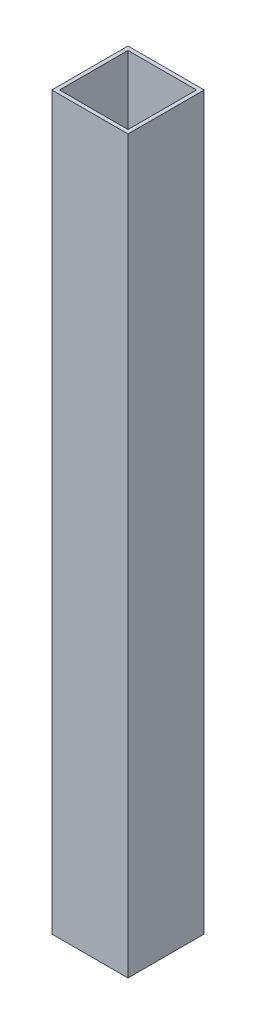
ISO-10303-21;
HEADER;
FILE_DESCRIPTION(('STEP AP214'),'2;1');
FILE_NAME('part.step','',(''),(''),'','','');
FILE_SCHEMA(('AUTOMOTIVE_DESIGN { 1 0 10303 214 1 1 1 1 }'));
ENDSEC;
DATA;
#1=APPLICATION_CONTEXT('core data for automotive mechanical design processes');
#2=APPLICATION_PROTOCOL_DEFINITION('international standard','automotive_design',2000,#1);
#3=PRODUCT_CONTEXT('',#1,'mechanical');
#4=PRODUCT('Part','Part','',(#3));
#5=PRODUCT_RELATED_PRODUCT_CATEGORY('part','',(#4));
#6=PRODUCT_DEFINITION_FORMATION('','',#4);
#7=PRODUCT_DEFINITION_CONTEXT('part definition',#1,'design');
#8=PRODUCT_DEFINITION('design','',#6,#7);
#9=PRODUCT_DEFINITION_SHAPE('','',#8);
#10=(LENGTH_UNIT() NAMED_UNIT(*) SI_UNIT(.MILLI.,.METRE.));
#11=(NAMED_UNIT(*) PLANE_ANGLE_UNIT() SI_UNIT($,.RADIAN.));
#12=(NAMED_UNIT(*) SI_UNIT($,.STERADIAN.) SOLID_ANGLE_UNIT());
#13=UNCERTAINTY_MEASURE_WITH_UNIT(LENGTH_MEASURE(1.E-05),#10,'distance_accuracy_value','');
#14=(GEOMETRIC_REPRESENTATION_CONTEXT(3) GLOBAL_UNCERTAINTY_ASSIGNED_CONTEXT((#13)) GLOBAL_UNIT_ASSIGNED_CONTEXT((#10,
#11,#12)) REPRESENTATION_CONTEXT('',''));
#15=CARTESIAN_POINT('',(0.,0.,0.));
#16=DIRECTION('',(0.,0.,1.));
#17=DIRECTION('',(1.,0.,0.));
#18=AXIS2_PLACEMENT_3D('',#15,#16,#17);
#19=CARTESIAN_POINT('',(0.,304.8,0.));
#20=DIRECTION('',(0.,-1.,0.));
#21=DIRECTION('',(0.,0.,-1.));
#22=AXIS2_PLACEMENT_3D('',#19,#20,#21);
#23=PLANE('',#22);
#24=DIRECTION('',(0.,0.,1.));
#25=VECTOR('',#24,1.);
#26=CARTESIAN_POINT('',(-15.875,304.8,-15.875));
#27=LINE('',#26,#25);
#28=CARTESIAN_POINT('',(-15.875,304.8,-15.875));
#29=VERTEX_POINT('',#28);
#30=CARTESIAN_POINT('',(-15.875,304.8,15.875));
#31=VERTEX_POINT('',#30);
#32=EDGE_CURVE('E159',#29,#31,#27,.T.);
#33=ORIENTED_EDGE('',*,*,#32,.T.);
#34=DIRECTION('',(1.,0.,0.));
#35=VECTOR('',#34,1.);
#36=CARTESIAN_POINT('',(15.875,304.8,15.875));
#37=LINE('',#36,#35);
#38=CARTESIAN_POINT('',(15.875,304.8,15.875));
#39=VERTEX_POINT('',#38);
#40=EDGE_CURVE('E163',#31,#39,#37,.T.);
#41=ORIENTED_EDGE('',*,*,#40,.T.);
#42=DIRECTION('',(0.,0.,-1.));
#43=VECTOR('',#42,1.);
#44=CARTESIAN_POINT('',(15.875,304.8,-15.875));
#45=LINE('',#44,#43);
#46=CARTESIAN_POINT('',(15.875,304.8,-15.875));
#47=VERTEX_POINT('',#46);
#48=EDGE_CURVE('E167',#39,#47,#45,.T.);
#49=ORIENTED_EDGE('',*,*,#48,.T.);
#50=DIRECTION('',(-1.,0.,0.));
#51=VECTOR('',#50,1.);
#52=CARTESIAN_POINT('',(15.875,304.8,-15.875));
#53=LINE('',#52,#51);
#54=EDGE_CURVE('E170',#47,#29,#53,.T.);
#55=ORIENTED_EDGE('',*,*,#54,.T.);
#56=EDGE_LOOP('',(#33,#41,#49,#55));
#57=FACE_BOUND('',#56,.T.);
#58=DIRECTION('',(0.,0.,1.));
#59=VECTOR('',#58,1.);
#60=CARTESIAN_POINT('',(-14.2875,304.8,14.2875));
#61=LINE('',#60,#59);
#62=CARTESIAN_POINT('',(-14.2875,304.8,-14.2875));
#63=VERTEX_POINT('',#62);
#64=CARTESIAN_POINT('',(-14.2875,304.8,14.2875));
#65=VERTEX_POINT('',#64);
#66=EDGE_CURVE('E111',#63,#65,#61,.T.);
#67=ORIENTED_EDGE('',*,*,#66,.F.);
#68=DIRECTION('',(-1.,0.,0.));
#69=VECTOR('',#68,1.);
#70=CARTESIAN_POINT('',(14.2875,304.8,-14.2875));
#71=LINE('',#70,#69);
#72=CARTESIAN_POINT('',(14.2875,304.8,-14.2875));
#73=VERTEX_POINT('',#72);
#74=EDGE_CURVE('E137',#73,#63,#71,.T.);
#75=ORIENTED_EDGE('',*,*,#74,.F.);
#76=DIRECTION('',(0.,0.,-1.));
#77=VECTOR('',#76,1.);
#78=CARTESIAN_POINT('',(14.2875,304.8,14.2875));
#79=LINE('',#78,#77);
#80=CARTESIAN_POINT('',(14.2875,304.8,14.2875));
#81=VERTEX_POINT('',#80);
#82=EDGE_CURVE('E133',#81,#73,#79,.T.);
#83=ORIENTED_EDGE('',*,*,#82,.F.);
#84=DIRECTION('',(1.,0.,0.));
#85=VECTOR('',#84,1.);
#86=CARTESIAN_POINT('',(14.2875,304.8,14.2875));
#87=LINE('',#86,#85);
#88=EDGE_CURVE('E120',#65,#81,#87,.T.);
#89=ORIENTED_EDGE('',*,*,#88,.F.);
#90=EDGE_LOOP('',(#67,#75,#83,#89));
#91=FACE_BOUND('',#90,.T.);
#92=ADVANCED_FACE('F45',(#57,#91),#23,.F.);
#93=CARTESIAN_POINT('',(0.,0.,0.));
#94=DIRECTION('',(0.,-1.,0.));
#95=DIRECTION('',(0.,0.,-1.));
#96=AXIS2_PLACEMENT_3D('',#93,#94,#95);
#97=PLANE('',#96);
#98=DIRECTION('',(0.,0.,1.));
#99=VECTOR('',#98,1.);
#100=CARTESIAN_POINT('',(-15.875,0.,-15.875));
#101=LINE('',#100,#99);
#102=CARTESIAN_POINT('',(-15.875,0.,-15.875));
#103=VERTEX_POINT('',#102);
#104=CARTESIAN_POINT('',(-15.875,0.,15.875));
#105=VERTEX_POINT('',#104);
#106=EDGE_CURVE('E129',#103,#105,#101,.T.);
#107=ORIENTED_EDGE('',*,*,#106,.F.);
#108=DIRECTION('',(-1.,0.,0.));
#109=VECTOR('',#108,1.);
#110=CARTESIAN_POINT('',(15.875,0.,-15.875));
#111=LINE('',#110,#109);
#112=CARTESIAN_POINT('',(15.875,0.,-15.875));
#113=VERTEX_POINT('',#112);
#114=EDGE_CURVE('E164',#113,#103,#111,.T.);
#115=ORIENTED_EDGE('',*,*,#114,.F.);
#116=DIRECTION('',(0.,0.,-1.));
#117=VECTOR('',#116,1.);
#118=CARTESIAN_POINT('',(15.875,0.,-15.875));
#119=LINE('',#118,#117);
#120=CARTESIAN_POINT('',(15.875,0.,15.875));
#121=VERTEX_POINT('',#120);
#122=EDGE_CURVE('E180',#121,#113,#119,.T.);
#123=ORIENTED_EDGE('',*,*,#122,.F.);
#124=DIRECTION('',(1.,0.,0.));
#125=VECTOR('',#124,1.);
#126=CARTESIAN_POINT('',(15.875,0.,15.875));
#127=LINE('',#126,#125);
#128=EDGE_CURVE('E177',#105,#121,#127,.T.);
#129=ORIENTED_EDGE('',*,*,#128,.F.);
#130=EDGE_LOOP('',(#107,#115,#123,#129));
#131=FACE_BOUND('',#130,.T.);
#132=DIRECTION('',(-1.,0.,0.));
#133=VECTOR('',#132,1.);
#134=CARTESIAN_POINT('',(14.2875,0.,-14.2875));
#135=LINE('',#134,#133);
#136=CARTESIAN_POINT('',(14.2875,0.,-14.2875));
#137=VERTEX_POINT('',#136);
#138=CARTESIAN_POINT('',(-14.2875,0.,-14.2875));
#139=VERTEX_POINT('',#138);
#140=EDGE_CURVE('E121',#137,#139,#135,.T.);
#141=ORIENTED_EDGE('',*,*,#140,.T.);
#142=DIRECTION('',(0.,0.,1.));
#143=VECTOR('',#142,1.);
#144=CARTESIAN_POINT('',(-14.2875,0.,14.2875));
#145=LINE('',#144,#143);
#146=CARTESIAN_POINT('',(-14.2875,0.,14.2875));
#147=VERTEX_POINT('',#146);
#148=EDGE_CURVE('E69',#139,#147,#145,.T.);
#149=ORIENTED_EDGE('',*,*,#148,.T.);
#150=DIRECTION('',(1.,0.,0.));
#151=VECTOR('',#150,1.);
#152=CARTESIAN_POINT('',(14.2875,0.,14.2875));
#153=LINE('',#152,#151);
#154=CARTESIAN_POINT('',(14.2875,0.,14.2875));
#155=VERTEX_POINT('',#154);
#156=EDGE_CURVE('E127',#147,#155,#153,.T.);
#157=ORIENTED_EDGE('',*,*,#156,.T.);
#158=DIRECTION('',(0.,0.,-1.));
#159=VECTOR('',#158,1.);
#160=CARTESIAN_POINT('',(14.2875,0.,14.2875));
#161=LINE('',#160,#159);
#162=EDGE_CURVE('E146',#155,#137,#161,.T.);
#163=ORIENTED_EDGE('',*,*,#162,.T.);
#164=EDGE_LOOP('',(#141,#149,#157,#163));
#165=FACE_BOUND('',#164,.T.);
#166=ADVANCED_FACE('F203',(#131,#165),#97,.T.);
#167=CARTESIAN_POINT('',(-15.875,304.8,-15.875));
#168=DIRECTION('',(1.,0.,0.));
#169=DIRECTION('',(0.,0.,-1.));
#170=AXIS2_PLACEMENT_3D('',#167,#168,#169);
#171=PLANE('',#170);
#172=ORIENTED_EDGE('',*,*,#106,.T.);
#173=DIRECTION('',(0.,-1.,0.));
#174=VECTOR('',#173,1.);
#175=CARTESIAN_POINT('',(-15.875,304.8,15.875));
#176=LINE('',#175,#174);
#177=EDGE_CURVE('E11',#31,#105,#176,.T.);
#178=ORIENTED_EDGE('',*,*,#177,.F.);
#179=ORIENTED_EDGE('',*,*,#32,.F.);
#180=DIRECTION('',(0.,-1.,0.));
#181=VECTOR('',#180,1.);
#182=CARTESIAN_POINT('',(-15.875,304.8,-15.875));
#183=LINE('',#182,#181);
#184=EDGE_CURVE('E173',#29,#103,#183,.T.);
#185=ORIENTED_EDGE('',*,*,#184,.T.);
#186=EDGE_LOOP('',(#172,#178,#179,#185));
#187=FACE_BOUND('',#186,.T.);
#188=ADVANCED_FACE('F47',(#187),#171,.F.);
#189=CARTESIAN_POINT('',(15.875,304.8,15.875));
#190=DIRECTION('',(0.,0.,-1.));
#191=DIRECTION('',(-1.,0.,0.));
#192=AXIS2_PLACEMENT_3D('',#189,#190,#191);
#193=PLANE('',#192);
#194=ORIENTED_EDGE('',*,*,#128,.T.);
#195=DIRECTION('',(0.,-1.,0.));
#196=VECTOR('',#195,1.);
#197=CARTESIAN_POINT('',(15.875,304.8,15.875));
#198=LINE('',#197,#196);
#199=EDGE_CURVE('E54',#39,#121,#198,.T.);
#200=ORIENTED_EDGE('',*,*,#199,.F.);
#201=ORIENTED_EDGE('',*,*,#40,.F.);
#202=ORIENTED_EDGE('',*,*,#177,.T.);
#203=EDGE_LOOP('',(#194,#200,#201,#202));
#204=FACE_BOUND('',#203,.T.);
#205=ADVANCED_FACE('F213',(#204),#193,.F.);
#206=CARTESIAN_POINT('',(15.875,304.8,-15.875));
#207=DIRECTION('',(-1.,0.,0.));
#208=DIRECTION('',(0.,0.,1.));
#209=AXIS2_PLACEMENT_3D('',#206,#207,#208);
#210=PLANE('',#209);
#211=ORIENTED_EDGE('',*,*,#122,.T.);
#212=DIRECTION('',(0.,-1.,0.));
#213=VECTOR('',#212,1.);
#214=CARTESIAN_POINT('',(15.875,304.8,-15.875));
#215=LINE('',#214,#213);
#216=EDGE_CURVE('E188',#47,#113,#215,.T.);
#217=ORIENTED_EDGE('',*,*,#216,.F.);
#218=ORIENTED_EDGE('',*,*,#48,.F.);
#219=ORIENTED_EDGE('',*,*,#199,.T.);
#220=EDGE_LOOP('',(#211,#217,#218,#219));
#221=FACE_BOUND('',#220,.T.);
#222=ADVANCED_FACE('F197',(#221),#210,.F.);
#223=CARTESIAN_POINT('',(15.875,304.8,-15.875));
#224=DIRECTION('',(0.,0.,1.));
#225=DIRECTION('',(1.,0.,0.));
#226=AXIS2_PLACEMENT_3D('',#223,#224,#225);
#227=PLANE('',#226);
#228=ORIENTED_EDGE('',*,*,#114,.T.);
#229=ORIENTED_EDGE('',*,*,#184,.F.);
#230=ORIENTED_EDGE('',*,*,#54,.F.);
#231=ORIENTED_EDGE('',*,*,#216,.T.);
#232=EDGE_LOOP('',(#228,#229,#230,#231));
#233=FACE_BOUND('',#232,.T.);
#234=ADVANCED_FACE('F207',(#233),#227,.F.);
#235=CARTESIAN_POINT('',(-14.2875,304.8,14.2875));
#236=DIRECTION('',(1.,0.,0.));
#237=DIRECTION('',(0.,0.,-1.));
#238=AXIS2_PLACEMENT_3D('',#235,#236,#237);
#239=PLANE('',#238);
#240=ORIENTED_EDGE('',*,*,#148,.F.);
#241=DIRECTION('',(0.,-1.,0.));
#242=VECTOR('',#241,1.);
#243=CARTESIAN_POINT('',(-14.2875,304.8,-14.2875));
#244=LINE('',#243,#242);
#245=EDGE_CURVE('E115',#63,#139,#244,.T.);
#246=ORIENTED_EDGE('',*,*,#245,.F.);
#247=ORIENTED_EDGE('',*,*,#66,.T.);
#248=DIRECTION('',(0.,-1.,0.));
#249=VECTOR('',#248,1.);
#250=CARTESIAN_POINT('',(-14.2875,304.8,14.2875));
#251=LINE('',#250,#249);
#252=EDGE_CURVE('E114',#65,#147,#251,.T.);
#253=ORIENTED_EDGE('',*,*,#252,.T.);
#254=EDGE_LOOP('',(#240,#246,#247,#253));
#255=FACE_BOUND('',#254,.T.);
#256=ADVANCED_FACE('F113',(#255),#239,.T.);
#257=CARTESIAN_POINT('',(14.2875,304.8,14.2875));
#258=DIRECTION('',(0.,0.,-1.));
#259=DIRECTION('',(-1.,0.,0.));
#260=AXIS2_PLACEMENT_3D('',#257,#258,#259);
#261=PLANE('',#260);
#262=ORIENTED_EDGE('',*,*,#156,.F.);
#263=ORIENTED_EDGE('',*,*,#252,.F.);
#264=ORIENTED_EDGE('',*,*,#88,.T.);
#265=DIRECTION('',(0.,-1.,0.));
#266=VECTOR('',#265,1.);
#267=CARTESIAN_POINT('',(14.2875,304.8,14.2875));
#268=LINE('',#267,#266);
#269=EDGE_CURVE('E130',#81,#155,#268,.T.);
#270=ORIENTED_EDGE('',*,*,#269,.T.);
#271=EDGE_LOOP('',(#262,#263,#264,#270));
#272=FACE_BOUND('',#271,.T.);
#273=ADVANCED_FACE('F124',(#272),#261,.T.);
#274=CARTESIAN_POINT('',(14.2875,304.8,14.2875));
#275=DIRECTION('',(-1.,0.,0.));
#276=DIRECTION('',(0.,0.,1.));
#277=AXIS2_PLACEMENT_3D('',#274,#275,#276);
#278=PLANE('',#277);
#279=ORIENTED_EDGE('',*,*,#162,.F.);
#280=ORIENTED_EDGE('',*,*,#269,.F.);
#281=ORIENTED_EDGE('',*,*,#82,.T.);
#282=DIRECTION('',(0.,-1.,0.));
#283=VECTOR('',#282,1.);
#284=CARTESIAN_POINT('',(14.2875,304.8,-14.2875));
#285=LINE('',#284,#283);
#286=EDGE_CURVE('E61',#73,#137,#285,.T.);
#287=ORIENTED_EDGE('',*,*,#286,.T.);
#288=EDGE_LOOP('',(#279,#280,#281,#287));
#289=FACE_BOUND('',#288,.T.);
#290=ADVANCED_FACE('F236',(#289),#278,.T.);
#291=CARTESIAN_POINT('',(14.2875,304.8,-14.2875));
#292=DIRECTION('',(0.,0.,1.));
#293=DIRECTION('',(1.,0.,0.));
#294=AXIS2_PLACEMENT_3D('',#291,#292,#293);
#295=PLANE('',#294);
#296=ORIENTED_EDGE('',*,*,#140,.F.);
#297=ORIENTED_EDGE('',*,*,#286,.F.);
#298=ORIENTED_EDGE('',*,*,#74,.T.);
#299=ORIENTED_EDGE('',*,*,#245,.T.);
#300=EDGE_LOOP('',(#296,#297,#298,#299));
#301=FACE_BOUND('',#300,.T.);
#302=ADVANCED_FACE('F240',(#301),#295,.T.);
#303=CLOSED_SHELL('',(#92,#166,#188,#205,#222,#234,#256,#273,#290,#302));
#304=MANIFOLD_SOLID_BREP('B2',#303);
#305=ADVANCED_BREP_SHAPE_REPRESENTATION('',(#18,#304),#14);
#306=SHAPE_DEFINITION_REPRESENTATION(#9,#305);
ENDSEC;
END-ISO-10303-21;
